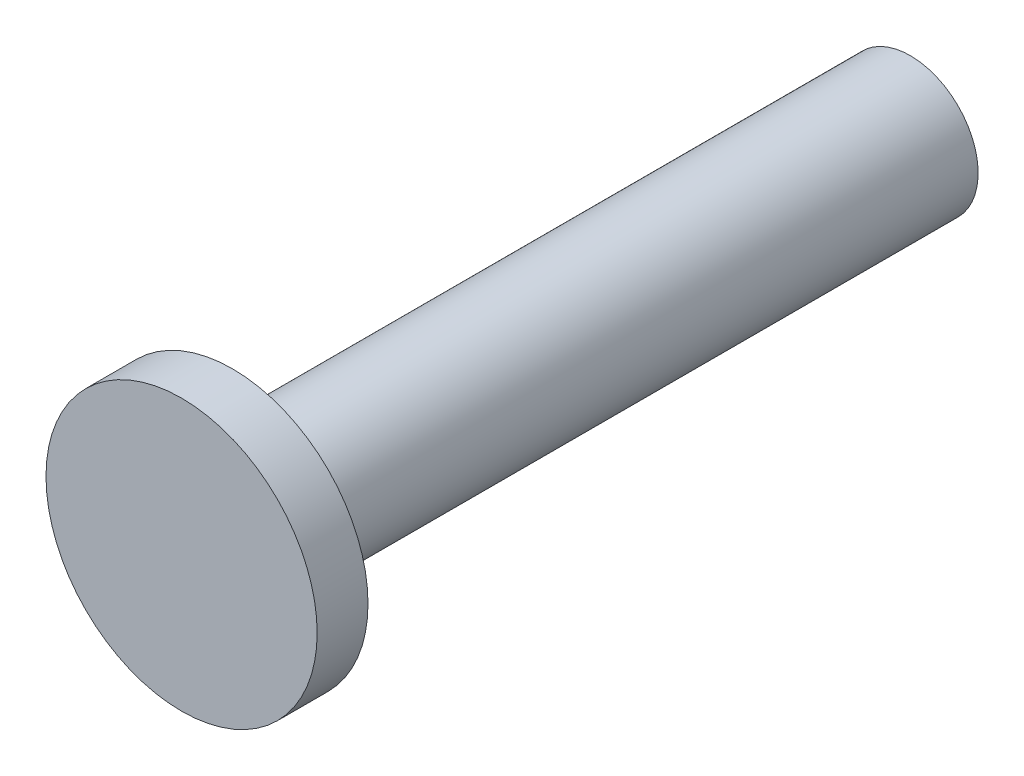
ISO-10303-21;
HEADER;
FILE_DESCRIPTION(('STEP AP214'),'2;1');
FILE_NAME('part.step','',(''),(''),'','','');
FILE_SCHEMA(('AUTOMOTIVE_DESIGN { 1 0 10303 214 1 1 1 1 }'));
ENDSEC;
DATA;
#1=APPLICATION_CONTEXT('core data for automotive mechanical design processes');
#2=APPLICATION_PROTOCOL_DEFINITION('international standard','automotive_design',2000,#1);
#3=PRODUCT_CONTEXT('',#1,'mechanical');
#4=PRODUCT('Part','Part','',(#3));
#5=PRODUCT_RELATED_PRODUCT_CATEGORY('part','',(#4));
#6=PRODUCT_DEFINITION_FORMATION('','',#4);
#7=PRODUCT_DEFINITION_CONTEXT('part definition',#1,'design');
#8=PRODUCT_DEFINITION('design','',#6,#7);
#9=PRODUCT_DEFINITION_SHAPE('','',#8);
#10=(LENGTH_UNIT() NAMED_UNIT(*) SI_UNIT(.MILLI.,.METRE.));
#11=(NAMED_UNIT(*) PLANE_ANGLE_UNIT() SI_UNIT($,.RADIAN.));
#12=(NAMED_UNIT(*) SI_UNIT($,.STERADIAN.) SOLID_ANGLE_UNIT());
#13=UNCERTAINTY_MEASURE_WITH_UNIT(LENGTH_MEASURE(1.E-05),#10,'distance_accuracy_value','');
#14=(GEOMETRIC_REPRESENTATION_CONTEXT(3) GLOBAL_UNCERTAINTY_ASSIGNED_CONTEXT((#13)) GLOBAL_UNIT_ASSIGNED_CONTEXT((#10,
#11,#12)) REPRESENTATION_CONTEXT('',''));
#15=CARTESIAN_POINT('',(0.,0.,0.));
#16=DIRECTION('',(0.,0.,1.));
#17=DIRECTION('',(1.,0.,0.));
#18=AXIS2_PLACEMENT_3D('',#15,#16,#17);
#19=CARTESIAN_POINT('',(0.,0.,1.5));
#20=DIRECTION('',(0.,0.,-1.));
#21=DIRECTION('',(-1.,0.,0.));
#22=AXIS2_PLACEMENT_3D('',#19,#20,#21);
#23=CYLINDRICAL_SURFACE('',#22,4.);
#24=CARTESIAN_POINT('',(0.,0.,1.5));
#25=DIRECTION('',(0.,0.,1.));
#26=DIRECTION('',(1.,0.,0.));
#27=AXIS2_PLACEMENT_3D('',#24,#25,#26);
#28=CIRCLE('',#27,4.);
#29=CARTESIAN_POINT('',(4.,0.,1.5));
#30=VERTEX_POINT('',#29);
#31=EDGE_CURVE('E38',#30,#30,#28,.T.);
#32=ORIENTED_EDGE('',*,*,#31,.F.);
#33=EDGE_LOOP('',(#32));
#34=FACE_BOUND('',#33,.T.);
#35=CARTESIAN_POINT('',(0.,0.,0.));
#36=DIRECTION('',(0.,0.,1.));
#37=DIRECTION('',(1.,0.,0.));
#38=AXIS2_PLACEMENT_3D('',#35,#36,#37);
#39=CIRCLE('',#38,4.);
#40=CARTESIAN_POINT('',(4.,0.,0.));
#41=VERTEX_POINT('',#40);
#42=EDGE_CURVE('E34',#41,#41,#39,.T.);
#43=ORIENTED_EDGE('',*,*,#42,.T.);
#44=EDGE_LOOP('',(#43));
#45=FACE_BOUND('',#44,.T.);
#46=ADVANCED_FACE('F31',(#34,#45),#23,.T.);
#47=CARTESIAN_POINT('',(0.,0.,1.5));
#48=DIRECTION('',(0.,0.,1.));
#49=DIRECTION('',(1.,0.,0.));
#50=AXIS2_PLACEMENT_3D('',#47,#48,#49);
#51=PLANE('',#50);
#52=ORIENTED_EDGE('',*,*,#31,.T.);
#53=EDGE_LOOP('',(#52));
#54=FACE_BOUND('',#53,.T.);
#55=ADVANCED_FACE('F55',(#54),#51,.T.);
#56=CARTESIAN_POINT('',(0.,0.,0.));
#57=DIRECTION('',(0.,0.,1.));
#58=DIRECTION('',(1.,0.,0.));
#59=AXIS2_PLACEMENT_3D('',#56,#57,#58);
#60=PLANE('',#59);
#61=CARTESIAN_POINT('',(0.,0.,0.));
#62=DIRECTION('',(0.,0.,-1.));
#63=DIRECTION('',(-1.,0.,0.));
#64=AXIS2_PLACEMENT_3D('',#61,#62,#63);
#65=CIRCLE('',#64,2.);
#66=CARTESIAN_POINT('',(-2.,0.,0.));
#67=VERTEX_POINT('',#66);
#68=EDGE_CURVE('E10',#67,#67,#65,.T.);
#69=ORIENTED_EDGE('',*,*,#68,.F.);
#70=EDGE_LOOP('',(#69));
#71=FACE_BOUND('',#70,.T.);
#72=ORIENTED_EDGE('',*,*,#42,.F.);
#73=EDGE_LOOP('',(#72));
#74=FACE_BOUND('',#73,.T.);
#75=ADVANCED_FACE('F52',(#71,#74),#60,.F.);
#76=CARTESIAN_POINT('',(0.,0.,-20.));
#77=DIRECTION('',(0.,0.,1.));
#78=DIRECTION('',(1.,0.,0.));
#79=AXIS2_PLACEMENT_3D('',#76,#77,#78);
#80=CYLINDRICAL_SURFACE('',#79,2.);
#81=CARTESIAN_POINT('',(0.,0.,-20.));
#82=DIRECTION('',(0.,0.,-1.));
#83=DIRECTION('',(-1.,0.,0.));
#84=AXIS2_PLACEMENT_3D('',#81,#82,#83);
#85=CIRCLE('',#84,2.);
#86=CARTESIAN_POINT('',(-2.,0.,-20.));
#87=VERTEX_POINT('',#86);
#88=EDGE_CURVE('E44',#87,#87,#85,.T.);
#89=ORIENTED_EDGE('',*,*,#88,.F.);
#90=EDGE_LOOP('',(#89));
#91=FACE_BOUND('',#90,.T.);
#92=ORIENTED_EDGE('',*,*,#68,.T.);
#93=EDGE_LOOP('',(#92));
#94=FACE_BOUND('',#93,.T.);
#95=ADVANCED_FACE('F54',(#91,#94),#80,.T.);
#96=CARTESIAN_POINT('',(0.,0.,-20.));
#97=DIRECTION('',(0.,0.,-1.));
#98=DIRECTION('',(-1.,0.,0.));
#99=AXIS2_PLACEMENT_3D('',#96,#97,#98);
#100=PLANE('',#99);
#101=ORIENTED_EDGE('',*,*,#88,.T.);
#102=EDGE_LOOP('',(#101));
#103=FACE_BOUND('',#102,.T.);
#104=ADVANCED_FACE('F61',(#103),#100,.T.);
#105=CLOSED_SHELL('',(#46,#55,#75,#95,#104));
#106=MANIFOLD_SOLID_BREP('B2',#105);
#107=ADVANCED_BREP_SHAPE_REPRESENTATION('',(#18,#106),#14);
#108=SHAPE_DEFINITION_REPRESENTATION(#9,#107);
ENDSEC;
END-ISO-10303-21;
